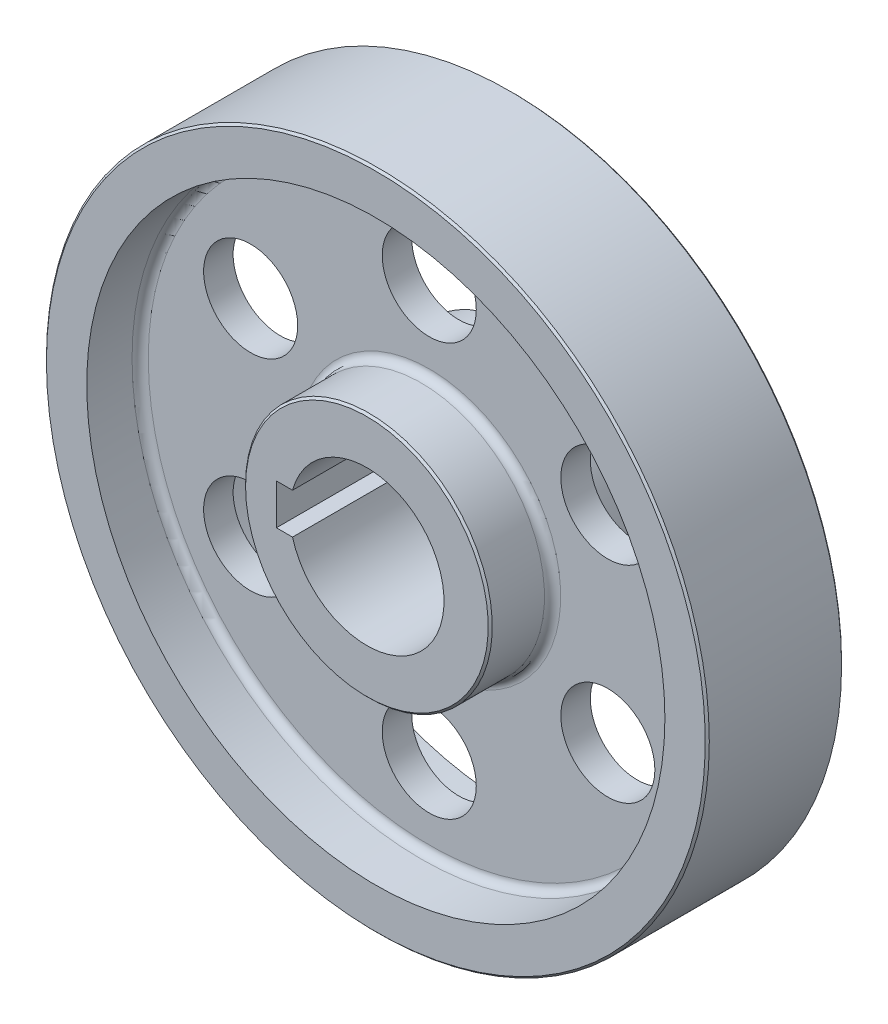
ISO-10303-21;
HEADER;
FILE_DESCRIPTION(('STEP AP214'),'2;1');
FILE_NAME('part.step','',(''),(''),'','','');
FILE_SCHEMA(('AUTOMOTIVE_DESIGN { 1 0 10303 214 1 1 1 1 }'));
ENDSEC;
DATA;
#1=APPLICATION_CONTEXT('core data for automotive mechanical design processes');
#2=APPLICATION_PROTOCOL_DEFINITION('international standard','automotive_design',2000,#1);
#3=PRODUCT_CONTEXT('',#1,'mechanical');
#4=PRODUCT('Part','Part','',(#3));
#5=PRODUCT_RELATED_PRODUCT_CATEGORY('part','',(#4));
#6=PRODUCT_DEFINITION_FORMATION('','',#4);
#7=PRODUCT_DEFINITION_CONTEXT('part definition',#1,'design');
#8=PRODUCT_DEFINITION('design','',#6,#7);
#9=PRODUCT_DEFINITION_SHAPE('','',#8);
#10=(LENGTH_UNIT() NAMED_UNIT(*) SI_UNIT(.MILLI.,.METRE.));
#11=(NAMED_UNIT(*) PLANE_ANGLE_UNIT() SI_UNIT($,.RADIAN.));
#12=(NAMED_UNIT(*) SI_UNIT($,.STERADIAN.) SOLID_ANGLE_UNIT());
#13=UNCERTAINTY_MEASURE_WITH_UNIT(LENGTH_MEASURE(1.E-05),#10,'distance_accuracy_value','');
#14=(GEOMETRIC_REPRESENTATION_CONTEXT(3) GLOBAL_UNCERTAINTY_ASSIGNED_CONTEXT((#13)) GLOBAL_UNIT_ASSIGNED_CONTEXT((#10,
#11,#12)) REPRESENTATION_CONTEXT('',''));
#15=CARTESIAN_POINT('',(0.,0.,0.));
#16=DIRECTION('',(0.,0.,1.));
#17=DIRECTION('',(1.,0.,0.));
#18=AXIS2_PLACEMENT_3D('',#15,#16,#17);
#19=CARTESIAN_POINT('',(0.,71.23775235,-5.2212868015927));
#20=DIRECTION('',(0.,0.,1.));
#21=DIRECTION('',(1.,0.,0.));
#22=AXIS2_PLACEMENT_3D('',#19,#20,#21);
#23=PLANE('',#22);
#24=CARTESIAN_POINT('',(0.,0.,-5.2212868015927));
#25=DIRECTION('',(0.,0.,1.));
#26=DIRECTION('',(1.,0.,0.));
#27=AXIS2_PLACEMENT_3D('',#24,#25,#26);
#28=CIRCLE('',#27,69.23775235);
#29=CARTESIAN_POINT('',(69.23775235,0.,-5.2212868015927));
#30=VERTEX_POINT('',#29);
#31=EDGE_CURVE('E420',#30,#30,#28,.F.);
#32=ORIENTED_EDGE('',*,*,#31,.T.);
#33=EDGE_LOOP('',(#32));
#34=FACE_BOUND('',#33,.T.);
#35=CARTESIAN_POINT('',(0.,0.,-5.2212868015927));
#36=DIRECTION('',(0.,0.,1.));
#37=DIRECTION('',(1.,0.,0.));
#38=AXIS2_PLACEMENT_3D('',#35,#36,#37);
#39=CIRCLE('',#38,32.4);
#40=CARTESIAN_POINT('',(32.4,0.,-5.2212868015927));
#41=VERTEX_POINT('',#40);
#42=EDGE_CURVE('E416',#41,#41,#39,.T.);
#43=ORIENTED_EDGE('',*,*,#42,.T.);
#44=EDGE_LOOP('',(#43));
#45=FACE_BOUND('',#44,.T.);
#46=CARTESIAN_POINT('',(0.,50.8188762,-5.2212868015927));
#47=DIRECTION('',(0.,0.,1.));
#48=DIRECTION('',(1.,0.,0.));
#49=AXIS2_PLACEMENT_3D('',#46,#47,#48);
#50=CIRCLE('',#49,11.58920475);
#51=CARTESIAN_POINT('',(11.58920475,50.8188762,-5.2212868015927));
#52=VERTEX_POINT('',#51);
#53=EDGE_CURVE('E339',#52,#52,#50,.F.);
#54=ORIENTED_EDGE('',*,*,#53,.F.);
#55=EDGE_LOOP('',(#54));
#56=FACE_BOUND('',#55,.T.);
#57=CARTESIAN_POINT('',(-44.0104377809757,25.4094380999987,-5.2212868015927));
#58=DIRECTION('',(0.,0.,1.));
#59=DIRECTION('',(1.,0.,0.));
#60=AXIS2_PLACEMENT_3D('',#57,#58,#59);
#61=CIRCLE('',#60,11.5892047500017);
#62=CARTESIAN_POINT('',(-32.4212330309741,25.4094380999987,-5.2212868015927));
#63=VERTEX_POINT('',#62);
#64=EDGE_CURVE('E348',#63,#63,#61,.F.);
#65=ORIENTED_EDGE('',*,*,#64,.F.);
#66=EDGE_LOOP('',(#65));
#67=FACE_BOUND('',#66,.T.);
#68=CARTESIAN_POINT('',(2.87004811364977E-12,-50.8188762,-5.2212868015927));
#69=DIRECTION('',(0.,0.,1.));
#70=DIRECTION('',(1.,0.,0.));
#71=AXIS2_PLACEMENT_3D('',#68,#69,#70);
#72=CIRCLE('',#71,11.5892047500031);
#73=CARTESIAN_POINT('',(11.589204750006,-50.8188762,-5.2212868015927));
#74=VERTEX_POINT('',#73);
#75=EDGE_CURVE('E365',#74,#74,#72,.F.);
#76=ORIENTED_EDGE('',*,*,#75,.F.);
#77=EDGE_LOOP('',(#76));
#78=FACE_BOUND('',#77,.T.);
#79=CARTESIAN_POINT('',(44.0104377809786,-25.4094380999988,-5.2212868015927));
#80=DIRECTION('',(0.,0.,1.));
#81=DIRECTION('',(1.,0.,0.));
#82=AXIS2_PLACEMENT_3D('',#79,#80,#81);
#83=CIRCLE('',#82,11.5892047500019);
#84=CARTESIAN_POINT('',(55.5996425309805,-25.4094380999988,-5.2212868015927));
#85=VERTEX_POINT('',#84);
#86=EDGE_CURVE('E357',#85,#85,#83,.F.);
#87=ORIENTED_EDGE('',*,*,#86,.F.);
#88=EDGE_LOOP('',(#87));
#89=FACE_BOUND('',#88,.T.);
#90=CARTESIAN_POINT('',(44.0104377809771,25.4094381000013,-5.2212868015927));
#91=DIRECTION('',(0.,0.,1.));
#92=DIRECTION('',(1.,0.,0.));
#93=AXIS2_PLACEMENT_3D('',#90,#91,#92);
#94=CIRCLE('',#93,11.5892047500004);
#95=CARTESIAN_POINT('',(55.5996425309776,25.4094381000013,-5.2212868015927));
#96=VERTEX_POINT('',#95);
#97=EDGE_CURVE('E340',#96,#96,#94,.F.);
#98=ORIENTED_EDGE('',*,*,#97,.F.);
#99=EDGE_LOOP('',(#98));
#100=FACE_BOUND('',#99,.T.);
#101=CARTESIAN_POINT('',(-44.0104377809742,-25.4094381000013,-5.2212868015927));
#102=DIRECTION('',(0.,0.,1.));
#103=DIRECTION('',(1.,0.,0.));
#104=AXIS2_PLACEMENT_3D('',#101,#102,#103);
#105=CIRCLE('',#104,11.5892047500029);
#106=CARTESIAN_POINT('',(-32.4212330309714,-25.4094381000013,-5.2212868015927));
#107=VERTEX_POINT('',#106);
#108=EDGE_CURVE('E373',#107,#107,#105,.F.);
#109=ORIENTED_EDGE('',*,*,#108,.F.);
#110=EDGE_LOOP('',(#109));
#111=FACE_BOUND('',#110,.T.);
#112=ADVANCED_FACE('F249',(#34,#45,#56,#67,#78,#89,#100,#111),#23,.F.);
#113=CARTESIAN_POINT('',(0.,71.23775235,2.0494716984073));
#114=DIRECTION('',(0.,0.,-1.));
#115=DIRECTION('',(-1.,0.,0.));
#116=AXIS2_PLACEMENT_3D('',#113,#114,#115);
#117=PLANE('',#116);
#118=CARTESIAN_POINT('',(0.,0.,2.0494716984073));
#119=DIRECTION('',(0.,0.,-1.));
#120=DIRECTION('',(-1.,0.,0.));
#121=AXIS2_PLACEMENT_3D('',#118,#119,#120);
#122=CIRCLE('',#121,32.4);
#123=CARTESIAN_POINT('',(-32.4,0.,2.0494716984073));
#124=VERTEX_POINT('',#123);
#125=EDGE_CURVE('E404',#124,#124,#122,.T.);
#126=ORIENTED_EDGE('',*,*,#125,.T.);
#127=EDGE_LOOP('',(#126));
#128=FACE_BOUND('',#127,.T.);
#129=CARTESIAN_POINT('',(0.,0.,2.0494716984073));
#130=DIRECTION('',(0.,0.,-1.));
#131=DIRECTION('',(-1.,0.,0.));
#132=AXIS2_PLACEMENT_3D('',#129,#130,#131);
#133=CIRCLE('',#132,69.23775235);
#134=CARTESIAN_POINT('',(-69.23775235,0.,2.0494716984073));
#135=VERTEX_POINT('',#134);
#136=EDGE_CURVE('E400',#135,#135,#133,.F.);
#137=ORIENTED_EDGE('',*,*,#136,.T.);
#138=EDGE_LOOP('',(#137));
#139=FACE_BOUND('',#138,.T.);
#140=CARTESIAN_POINT('',(0.,50.8188762,2.0494716984073));
#141=DIRECTION('',(0.,0.,1.));
#142=DIRECTION('',(1.,0.,0.));
#143=AXIS2_PLACEMENT_3D('',#140,#141,#142);
#144=CIRCLE('',#143,11.58920475);
#145=CARTESIAN_POINT('',(11.58920475,50.8188762,2.0494716984073));
#146=VERTEX_POINT('',#145);
#147=EDGE_CURVE('E335',#146,#146,#144,.T.);
#148=ORIENTED_EDGE('',*,*,#147,.F.);
#149=EDGE_LOOP('',(#148));
#150=FACE_BOUND('',#149,.T.);
#151=CARTESIAN_POINT('',(-44.0104377809757,25.4094380999987,2.0494716984073));
#152=DIRECTION('',(0.,0.,1.));
#153=DIRECTION('',(1.,0.,0.));
#154=AXIS2_PLACEMENT_3D('',#151,#152,#153);
#155=CIRCLE('',#154,11.5892047500017);
#156=CARTESIAN_POINT('',(-32.4212330309741,25.4094380999987,2.0494716984073));
#157=VERTEX_POINT('',#156);
#158=EDGE_CURVE('E307',#157,#157,#155,.T.);
#159=ORIENTED_EDGE('',*,*,#158,.F.);
#160=EDGE_LOOP('',(#159));
#161=FACE_BOUND('',#160,.T.);
#162=CARTESIAN_POINT('',(2.87004811364977E-12,-50.8188762,2.0494716984073));
#163=DIRECTION('',(0.,0.,1.));
#164=DIRECTION('',(1.,0.,0.));
#165=AXIS2_PLACEMENT_3D('',#162,#163,#164);
#166=CIRCLE('',#165,11.5892047500031);
#167=CARTESIAN_POINT('',(11.589204750006,-50.8188762,2.0494716984073));
#168=VERTEX_POINT('',#167);
#169=EDGE_CURVE('E369',#168,#168,#166,.T.);
#170=ORIENTED_EDGE('',*,*,#169,.F.);
#171=EDGE_LOOP('',(#170));
#172=FACE_BOUND('',#171,.T.);
#173=CARTESIAN_POINT('',(44.0104377809786,-25.4094380999988,2.0494716984073));
#174=DIRECTION('',(0.,0.,1.));
#175=DIRECTION('',(1.,0.,0.));
#176=AXIS2_PLACEMENT_3D('',#173,#174,#175);
#177=CIRCLE('',#176,11.5892047500019);
#178=CARTESIAN_POINT('',(55.5996425309805,-25.4094380999988,2.0494716984073));
#179=VERTEX_POINT('',#178);
#180=EDGE_CURVE('E361',#179,#179,#177,.T.);
#181=ORIENTED_EDGE('',*,*,#180,.F.);
#182=EDGE_LOOP('',(#181));
#183=FACE_BOUND('',#182,.T.);
#184=CARTESIAN_POINT('',(44.0104377809771,25.4094381000013,2.0494716984073));
#185=DIRECTION('',(0.,0.,1.));
#186=DIRECTION('',(1.,0.,0.));
#187=AXIS2_PLACEMENT_3D('',#184,#185,#186);
#188=CIRCLE('',#187,11.5892047500004);
#189=CARTESIAN_POINT('',(55.5996425309776,25.4094381000013,2.0494716984073));
#190=VERTEX_POINT('',#189);
#191=EDGE_CURVE('E353',#190,#190,#188,.T.);
#192=ORIENTED_EDGE('',*,*,#191,.F.);
#193=EDGE_LOOP('',(#192));
#194=FACE_BOUND('',#193,.T.);
#195=CARTESIAN_POINT('',(-44.0104377809742,-25.4094381000013,2.0494716984073));
#196=DIRECTION('',(0.,0.,1.));
#197=DIRECTION('',(1.,0.,0.));
#198=AXIS2_PLACEMENT_3D('',#195,#196,#197);
#199=CIRCLE('',#198,11.5892047500029);
#200=CARTESIAN_POINT('',(-32.4212330309714,-25.4094381000013,2.0494716984073));
#201=VERTEX_POINT('',#200);
#202=EDGE_CURVE('E352',#201,#201,#199,.T.);
#203=ORIENTED_EDGE('',*,*,#202,.F.);
#204=EDGE_LOOP('',(#203));
#205=FACE_BOUND('',#204,.T.);
#206=ADVANCED_FACE('F484',(#128,#139,#150,#161,#172,#183,#194,#205),#117,.F.);
#207=CARTESIAN_POINT('',(0.,30.4,17.4140924484073));
#208=DIRECTION('',(0.,0.,-1.));
#209=DIRECTION('',(-1.,0.,0.));
#210=AXIS2_PLACEMENT_3D('',#207,#208,#209);
#211=PLANE('',#210);
#212=CARTESIAN_POINT('',(0.,0.,17.4140924484073));
#213=DIRECTION('',(0.,0.,-1.));
#214=DIRECTION('',(-1.,0.,0.));
#215=AXIS2_PLACEMENT_3D('',#212,#213,#214);
#216=CIRCLE('',#215,29.9);
#217=CARTESIAN_POINT('',(-29.9,0.,17.4140924484073));
#218=VERTEX_POINT('',#217);
#219=EDGE_CURVE('E436',#218,#218,#216,.F.);
#220=ORIENTED_EDGE('',*,*,#219,.T.);
#221=EDGE_LOOP('',(#220));
#222=FACE_BOUND('',#221,.T.);
#223=DIRECTION('',(0.,-1.,0.));
#224=VECTOR('',#223,1.);
#225=CARTESIAN_POINT('',(-22.3,5.,17.4140924484073));
#226=LINE('',#225,#224);
#227=CARTESIAN_POINT('',(-22.3,5.,17.4140924484073));
#228=VERTEX_POINT('',#227);
#229=CARTESIAN_POINT('',(-22.3,-5.,17.4140924484073));
#230=VERTEX_POINT('',#229);
#231=EDGE_CURVE('E319',#228,#230,#226,.T.);
#232=ORIENTED_EDGE('',*,*,#231,.F.);
#233=DIRECTION('',(-1.,0.,0.));
#234=VECTOR('',#233,1.);
#235=CARTESIAN_POINT('',(-22.3,5.,17.4140924484073));
#236=LINE('',#235,#234);
#237=CARTESIAN_POINT('',(-18.3303027798234,5.,17.4140924484073));
#238=VERTEX_POINT('',#237);
#239=EDGE_CURVE('E294',#238,#228,#236,.T.);
#240=ORIENTED_EDGE('',*,*,#239,.F.);
#241=CARTESIAN_POINT('',(0.,0.,17.4140924484073));
#242=DIRECTION('',(0.,0.,1.));
#243=DIRECTION('',(1.,0.,0.));
#244=AXIS2_PLACEMENT_3D('',#241,#242,#243);
#245=CIRCLE('',#244,19.);
#246=CARTESIAN_POINT('',(-18.3303027798234,-5.,17.4140924484073));
#247=VERTEX_POINT('',#246);
#248=EDGE_CURVE('E392',#247,#238,#245,.T.);
#249=ORIENTED_EDGE('',*,*,#248,.F.);
#250=DIRECTION('',(1.,0.,0.));
#251=VECTOR('',#250,1.);
#252=CARTESIAN_POINT('',(-22.3,-5.,17.4140924484073));
#253=LINE('',#252,#251);
#254=EDGE_CURVE('E300',#230,#247,#253,.T.);
#255=ORIENTED_EDGE('',*,*,#254,.F.);
#256=EDGE_LOOP('',(#232,#240,#249,#255));
#257=FACE_BOUND('',#256,.T.);
#258=ADVANCED_FACE('F490',(#222,#257),#211,.F.);
#259=CARTESIAN_POINT('',(0.,0.,17.4140924484073));
#260=DIRECTION('',(0.,0.,1.));
#261=DIRECTION('',(1.,0.,0.));
#262=AXIS2_PLACEMENT_3D('',#259,#260,#261);
#263=CYLINDRICAL_SURFACE('',#262,19.);
#264=ORIENTED_EDGE('',*,*,#248,.T.);
#265=DIRECTION('',(0.,0.,1.));
#266=VECTOR('',#265,1.);
#267=CARTESIAN_POINT('',(-18.3303027798234,5.,-20.5869075515927));
#268=LINE('',#267,#266);
#269=CARTESIAN_POINT('',(-18.3303027798234,5.,-20.5859075515927));
#270=VERTEX_POINT('',#269);
#271=EDGE_CURVE('E308',#270,#238,#268,.T.);
#272=ORIENTED_EDGE('',*,*,#271,.F.);
#273=CARTESIAN_POINT('',(0.,0.,-20.5859075515927));
#274=DIRECTION('',(0.,0.,1.));
#275=DIRECTION('',(1.,0.,0.));
#276=AXIS2_PLACEMENT_3D('',#273,#274,#275);
#277=CIRCLE('',#276,19.);
#278=CARTESIAN_POINT('',(-18.3303027798234,-5.,-20.5859075515927));
#279=VERTEX_POINT('',#278);
#280=EDGE_CURVE('E313',#279,#270,#277,.T.);
#281=ORIENTED_EDGE('',*,*,#280,.F.);
#282=DIRECTION('',(0.,0.,1.));
#283=VECTOR('',#282,1.);
#284=CARTESIAN_POINT('',(-18.3303027798234,-5.,-20.5869075515927));
#285=LINE('',#284,#283);
#286=EDGE_CURVE('E329',#279,#247,#285,.T.);
#287=ORIENTED_EDGE('',*,*,#286,.T.);
#288=EDGE_LOOP('',(#264,#272,#281,#287));
#289=FACE_BOUND('',#288,.T.);
#290=ADVANCED_FACE('F503',(#289),#263,.F.);
#291=CARTESIAN_POINT('',(0.,19.,-20.5859075515927));
#292=DIRECTION('',(0.,0.,1.));
#293=DIRECTION('',(1.,0.,0.));
#294=AXIS2_PLACEMENT_3D('',#291,#292,#293);
#295=PLANE('',#294);
#296=CARTESIAN_POINT('',(0.,0.,-20.5859075515927));
#297=DIRECTION('',(0.,0.,1.));
#298=DIRECTION('',(1.,0.,0.));
#299=AXIS2_PLACEMENT_3D('',#296,#297,#298);
#300=CIRCLE('',#299,29.9);
#301=CARTESIAN_POINT('',(29.9,0.,-20.5859075515927));
#302=VERTEX_POINT('',#301);
#303=EDGE_CURVE('E432',#302,#302,#300,.F.);
#304=ORIENTED_EDGE('',*,*,#303,.T.);
#305=EDGE_LOOP('',(#304));
#306=FACE_BOUND('',#305,.T.);
#307=ORIENTED_EDGE('',*,*,#280,.T.);
#308=DIRECTION('',(1.,0.,0.));
#309=VECTOR('',#308,1.);
#310=CARTESIAN_POINT('',(-22.3,5.,-20.5859075515927));
#311=LINE('',#310,#309);
#312=CARTESIAN_POINT('',(-22.3,5.,-20.5859075515927));
#313=VERTEX_POINT('',#312);
#314=EDGE_CURVE('E274',#313,#270,#311,.T.);
#315=ORIENTED_EDGE('',*,*,#314,.F.);
#316=DIRECTION('',(0.,1.,0.));
#317=VECTOR('',#316,1.);
#318=CARTESIAN_POINT('',(-22.3,5.,-20.5859075515927));
#319=LINE('',#318,#317);
#320=CARTESIAN_POINT('',(-22.3,-5.,-20.5859075515927));
#321=VERTEX_POINT('',#320);
#322=EDGE_CURVE('E303',#321,#313,#319,.T.);
#323=ORIENTED_EDGE('',*,*,#322,.F.);
#324=DIRECTION('',(-1.,0.,0.));
#325=VECTOR('',#324,1.);
#326=CARTESIAN_POINT('',(-22.3,-5.,-20.5859075515927));
#327=LINE('',#326,#325);
#328=EDGE_CURVE('E266',#279,#321,#327,.T.);
#329=ORIENTED_EDGE('',*,*,#328,.F.);
#330=EDGE_LOOP('',(#307,#315,#323,#329));
#331=FACE_BOUND('',#330,.T.);
#332=ADVANCED_FACE('F311',(#306,#331),#295,.F.);
#333=CARTESIAN_POINT('',(0.,0.,17.4140924484073));
#334=DIRECTION('',(0.,0.,1.));
#335=DIRECTION('',(1.,0.,0.));
#336=AXIS2_PLACEMENT_3D('',#333,#334,#335);
#337=CYLINDRICAL_SURFACE('',#336,30.4);
#338=CARTESIAN_POINT('',(0.,0.,-20.0859075515927));
#339=DIRECTION('',(0.,0.,1.));
#340=DIRECTION('',(1.,0.,0.));
#341=AXIS2_PLACEMENT_3D('',#338,#339,#340);
#342=CIRCLE('',#341,30.4);
#343=CARTESIAN_POINT('',(30.4,0.,-20.0859075515927));
#344=VERTEX_POINT('',#343);
#345=EDGE_CURVE('E428',#344,#344,#342,.T.);
#346=ORIENTED_EDGE('',*,*,#345,.T.);
#347=EDGE_LOOP('',(#346));
#348=FACE_BOUND('',#347,.T.);
#349=CARTESIAN_POINT('',(0.,0.,-7.2212868015927));
#350=DIRECTION('',(0.,0.,1.));
#351=DIRECTION('',(1.,0.,0.));
#352=AXIS2_PLACEMENT_3D('',#349,#350,#351);
#353=CIRCLE('',#352,30.4);
#354=CARTESIAN_POINT('',(30.4,0.,-7.2212868015927));
#355=VERTEX_POINT('',#354);
#356=EDGE_CURVE('E424',#355,#355,#353,.F.);
#357=ORIENTED_EDGE('',*,*,#356,.T.);
#358=EDGE_LOOP('',(#357));
#359=FACE_BOUND('',#358,.T.);
#360=ADVANCED_FACE('F497',(#348,#359),#337,.T.);
#361=CARTESIAN_POINT('',(0.,0.,17.4140924484073));
#362=DIRECTION('',(0.,0.,1.));
#363=DIRECTION('',(1.,0.,0.));
#364=AXIS2_PLACEMENT_3D('',#361,#362,#363);
#365=CYLINDRICAL_SURFACE('',#364,71.23775235);
#366=CARTESIAN_POINT('',(0.,0.,-7.2212868015927));
#367=DIRECTION('',(0.,0.,1.));
#368=DIRECTION('',(1.,0.,0.));
#369=AXIS2_PLACEMENT_3D('',#366,#367,#368);
#370=CIRCLE('',#369,71.23775235);
#371=CARTESIAN_POINT('',(71.23775235,0.,-7.2212868015927));
#372=VERTEX_POINT('',#371);
#373=EDGE_CURVE('E412',#372,#372,#370,.T.);
#374=ORIENTED_EDGE('',*,*,#373,.T.);
#375=EDGE_LOOP('',(#374));
#376=FACE_BOUND('',#375,.T.);
#377=CARTESIAN_POINT('',(0.,0.,-18.3859075515927));
#378=DIRECTION('',(0.,0.,1.));
#379=DIRECTION('',(1.,0.,0.));
#380=AXIS2_PLACEMENT_3D('',#377,#378,#379);
#381=CIRCLE('',#380,71.23775235);
#382=CARTESIAN_POINT('',(71.23775235,0.,-18.3859075515927));
#383=VERTEX_POINT('',#382);
#384=EDGE_CURVE('E386',#383,#383,#381,.T.);
#385=ORIENTED_EDGE('',*,*,#384,.F.);
#386=EDGE_LOOP('',(#385));
#387=FACE_BOUND('',#386,.T.);
#388=ADVANCED_FACE('F495',(#376,#387),#365,.F.);
#389=CARTESIAN_POINT('',(0.,71.23775235,-18.3859075515927));
#390=DIRECTION('',(0.,0.,1.));
#391=DIRECTION('',(1.,0.,0.));
#392=AXIS2_PLACEMENT_3D('',#389,#390,#391);
#393=PLANE('',#392);
#394=CARTESIAN_POINT('',(0.,0.,-18.3859075515927));
#395=DIRECTION('',(0.,0.,1.));
#396=DIRECTION('',(1.,0.,0.));
#397=AXIS2_PLACEMENT_3D('',#394,#395,#396);
#398=CIRCLE('',#397,81.1785385);
#399=CARTESIAN_POINT('',(81.1785385,0.,-18.3859075515927));
#400=VERTEX_POINT('',#399);
#401=EDGE_CURVE('E12',#400,#400,#398,.F.);
#402=ORIENTED_EDGE('',*,*,#401,.T.);
#403=EDGE_LOOP('',(#402));
#404=FACE_BOUND('',#403,.T.);
#405=ORIENTED_EDGE('',*,*,#384,.T.);
#406=EDGE_LOOP('',(#405));
#407=FACE_BOUND('',#406,.T.);
#408=ADVANCED_FACE('F652',(#404,#407),#393,.F.);
#409=CARTESIAN_POINT('',(0.,0.,17.4140924484073));
#410=DIRECTION('',(0.,0.,1.));
#411=DIRECTION('',(1.,0.,0.));
#412=AXIS2_PLACEMENT_3D('',#409,#410,#411);
#413=CYLINDRICAL_SURFACE('',#412,81.6785385);
#414=CARTESIAN_POINT('',(0.,0.,14.7140924484073));
#415=DIRECTION('',(0.,0.,-1.));
#416=DIRECTION('',(-1.,0.,0.));
#417=AXIS2_PLACEMENT_3D('',#414,#415,#416);
#418=CIRCLE('',#417,81.6785385);
#419=CARTESIAN_POINT('',(-81.6785385,0.,14.7140924484073));
#420=VERTEX_POINT('',#419);
#421=EDGE_CURVE('E259',#420,#420,#418,.T.);
#422=ORIENTED_EDGE('',*,*,#421,.T.);
#423=EDGE_LOOP('',(#422));
#424=FACE_BOUND('',#423,.T.);
#425=CARTESIAN_POINT('',(0.,0.,-17.8859075515927));
#426=DIRECTION('',(0.,0.,1.));
#427=DIRECTION('',(1.,0.,0.));
#428=AXIS2_PLACEMENT_3D('',#425,#426,#427);
#429=CIRCLE('',#428,81.6785385);
#430=CARTESIAN_POINT('',(81.6785385,0.,-17.8859075515927));
#431=VERTEX_POINT('',#430);
#432=EDGE_CURVE('E448',#431,#431,#429,.T.);
#433=ORIENTED_EDGE('',*,*,#432,.T.);
#434=EDGE_LOOP('',(#433));
#435=FACE_BOUND('',#434,.T.);
#436=ADVANCED_FACE('F456',(#424,#435),#413,.T.);
#437=CARTESIAN_POINT('',(0.,81.6785385,15.2140924484073));
#438=DIRECTION('',(0.,0.,-1.));
#439=DIRECTION('',(-1.,0.,0.));
#440=AXIS2_PLACEMENT_3D('',#437,#438,#439);
#441=PLANE('',#440);
#442=CARTESIAN_POINT('',(0.,0.,15.2140924484073));
#443=DIRECTION('',(0.,0.,-1.));
#444=DIRECTION('',(-1.,0.,0.));
#445=AXIS2_PLACEMENT_3D('',#442,#443,#444);
#446=CIRCLE('',#445,81.1785385);
#447=CARTESIAN_POINT('',(-81.1785385,0.,15.2140924484073));
#448=VERTEX_POINT('',#447);
#449=EDGE_CURVE('E444',#448,#448,#446,.F.);
#450=ORIENTED_EDGE('',*,*,#449,.T.);
#451=EDGE_LOOP('',(#450));
#452=FACE_BOUND('',#451,.T.);
#453=CARTESIAN_POINT('',(0.,0.,15.2140924484073));
#454=DIRECTION('',(0.,0.,1.));
#455=DIRECTION('',(1.,0.,0.));
#456=AXIS2_PLACEMENT_3D('',#453,#454,#455);
#457=CIRCLE('',#456,71.23775235);
#458=CARTESIAN_POINT('',(71.23775235,0.,15.2140924484073));
#459=VERTEX_POINT('',#458);
#460=EDGE_CURVE('E344',#459,#459,#457,.T.);
#461=ORIENTED_EDGE('',*,*,#460,.F.);
#462=EDGE_LOOP('',(#461));
#463=FACE_BOUND('',#462,.T.);
#464=ADVANCED_FACE('F465',(#452,#463),#441,.F.);
#465=CARTESIAN_POINT('',(0.,0.,17.4140924484073));
#466=DIRECTION('',(0.,0.,1.));
#467=DIRECTION('',(1.,0.,0.));
#468=AXIS2_PLACEMENT_3D('',#465,#466,#467);
#469=CYLINDRICAL_SURFACE('',#468,71.23775235);
#470=CARTESIAN_POINT('',(0.,0.,4.0494716984073));
#471=DIRECTION('',(0.,0.,-1.));
#472=DIRECTION('',(-1.,0.,0.));
#473=AXIS2_PLACEMENT_3D('',#470,#471,#472);
#474=CIRCLE('',#473,71.23775235);
#475=CARTESIAN_POINT('',(-71.23775235,0.,4.0494716984073));
#476=VERTEX_POINT('',#475);
#477=EDGE_CURVE('E408',#476,#476,#474,.T.);
#478=ORIENTED_EDGE('',*,*,#477,.T.);
#479=EDGE_LOOP('',(#478));
#480=FACE_BOUND('',#479,.T.);
#481=ORIENTED_EDGE('',*,*,#460,.T.);
#482=EDGE_LOOP('',(#481));
#483=FACE_BOUND('',#482,.T.);
#484=ADVANCED_FACE('F468',(#480,#483),#469,.F.);
#485=CARTESIAN_POINT('',(0.,0.,17.4140924484073));
#486=DIRECTION('',(0.,0.,1.));
#487=DIRECTION('',(1.,0.,0.));
#488=AXIS2_PLACEMENT_3D('',#485,#486,#487);
#489=CYLINDRICAL_SURFACE('',#488,30.4);
#490=CARTESIAN_POINT('',(0.,0.,16.9140924484073));
#491=DIRECTION('',(0.,0.,-1.));
#492=DIRECTION('',(-1.,0.,0.));
#493=AXIS2_PLACEMENT_3D('',#490,#491,#492);
#494=CIRCLE('',#493,30.4);
#495=CARTESIAN_POINT('',(-30.4,0.,16.9140924484073));
#496=VERTEX_POINT('',#495);
#497=EDGE_CURVE('E440',#496,#496,#494,.T.);
#498=ORIENTED_EDGE('',*,*,#497,.T.);
#499=EDGE_LOOP('',(#498));
#500=FACE_BOUND('',#499,.T.);
#501=CARTESIAN_POINT('',(0.,0.,4.0494716984073));
#502=DIRECTION('',(0.,0.,-1.));
#503=DIRECTION('',(-1.,0.,0.));
#504=AXIS2_PLACEMENT_3D('',#501,#502,#503);
#505=CIRCLE('',#504,30.4);
#506=CARTESIAN_POINT('',(-30.4,0.,4.0494716984073));
#507=VERTEX_POINT('',#506);
#508=EDGE_CURVE('E396',#507,#507,#505,.F.);
#509=ORIENTED_EDGE('',*,*,#508,.T.);
#510=EDGE_LOOP('',(#509));
#511=FACE_BOUND('',#510,.T.);
#512=ADVANCED_FACE('F473',(#500,#511),#489,.T.);
#513=CARTESIAN_POINT('',(44.0104377809771,25.4094381000013,-20.5869075515927));
#514=DIRECTION('',(0.,0.,1.));
#515=DIRECTION('',(1.,0.,0.));
#516=AXIS2_PLACEMENT_3D('',#513,#514,#515);
#517=CYLINDRICAL_SURFACE('',#516,11.5892047500004);
#518=ORIENTED_EDGE('',*,*,#191,.T.);
#519=EDGE_LOOP('',(#518));
#520=FACE_BOUND('',#519,.T.);
#521=ORIENTED_EDGE('',*,*,#97,.T.);
#522=EDGE_LOOP('',(#521));
#523=FACE_BOUND('',#522,.T.);
#524=ADVANCED_FACE('F479',(#520,#523),#517,.F.);
#525=CARTESIAN_POINT('',(44.0104377809786,-25.4094380999988,-20.5869075515927));
#526=DIRECTION('',(0.,0.,1.));
#527=DIRECTION('',(1.,0.,0.));
#528=AXIS2_PLACEMENT_3D('',#525,#526,#527);
#529=CYLINDRICAL_SURFACE('',#528,11.5892047500019);
#530=ORIENTED_EDGE('',*,*,#180,.T.);
#531=EDGE_LOOP('',(#530));
#532=FACE_BOUND('',#531,.T.);
#533=ORIENTED_EDGE('',*,*,#86,.T.);
#534=EDGE_LOOP('',(#533));
#535=FACE_BOUND('',#534,.T.);
#536=ADVANCED_FACE('F574',(#532,#535),#529,.F.);
#537=CARTESIAN_POINT('',(2.87004811364977E-12,-50.8188762,-20.5869075515927));
#538=DIRECTION('',(0.,0.,1.));
#539=DIRECTION('',(1.,0.,0.));
#540=AXIS2_PLACEMENT_3D('',#537,#538,#539);
#541=CYLINDRICAL_SURFACE('',#540,11.5892047500031);
#542=ORIENTED_EDGE('',*,*,#169,.T.);
#543=EDGE_LOOP('',(#542));
#544=FACE_BOUND('',#543,.T.);
#545=ORIENTED_EDGE('',*,*,#75,.T.);
#546=EDGE_LOOP('',(#545));
#547=FACE_BOUND('',#546,.T.);
#548=ADVANCED_FACE('F570',(#544,#547),#541,.F.);
#549=CARTESIAN_POINT('',(-44.0104377809757,25.4094380999987,-20.5869075515927));
#550=DIRECTION('',(0.,0.,1.));
#551=DIRECTION('',(1.,0.,0.));
#552=AXIS2_PLACEMENT_3D('',#549,#550,#551);
#553=CYLINDRICAL_SURFACE('',#552,11.5892047500017);
#554=ORIENTED_EDGE('',*,*,#158,.T.);
#555=EDGE_LOOP('',(#554));
#556=FACE_BOUND('',#555,.T.);
#557=ORIENTED_EDGE('',*,*,#64,.T.);
#558=EDGE_LOOP('',(#557));
#559=FACE_BOUND('',#558,.T.);
#560=ADVANCED_FACE('F566',(#556,#559),#553,.F.);
#561=CARTESIAN_POINT('',(0.,50.8188762,-20.5869075515927));
#562=DIRECTION('',(0.,0.,1.));
#563=DIRECTION('',(1.,0.,0.));
#564=AXIS2_PLACEMENT_3D('',#561,#562,#563);
#565=CYLINDRICAL_SURFACE('',#564,11.58920475);
#566=ORIENTED_EDGE('',*,*,#147,.T.);
#567=EDGE_LOOP('',(#566));
#568=FACE_BOUND('',#567,.T.);
#569=ORIENTED_EDGE('',*,*,#53,.T.);
#570=EDGE_LOOP('',(#569));
#571=FACE_BOUND('',#570,.T.);
#572=ADVANCED_FACE('F563',(#568,#571),#565,.F.);
#573=CARTESIAN_POINT('',(-44.0104377809742,-25.4094381000013,-20.5869075515927));
#574=DIRECTION('',(0.,0.,1.));
#575=DIRECTION('',(1.,0.,0.));
#576=AXIS2_PLACEMENT_3D('',#573,#574,#575);
#577=CYLINDRICAL_SURFACE('',#576,11.5892047500029);
#578=ORIENTED_EDGE('',*,*,#202,.T.);
#579=EDGE_LOOP('',(#578));
#580=FACE_BOUND('',#579,.T.);
#581=ORIENTED_EDGE('',*,*,#108,.T.);
#582=EDGE_LOOP('',(#581));
#583=FACE_BOUND('',#582,.T.);
#584=ADVANCED_FACE('F515',(#580,#583),#577,.F.);
#585=CARTESIAN_POINT('',(0.,0.,4.0494716984073));
#586=DIRECTION('',(0.,0.,-1.));
#587=DIRECTION('',(-1.,0.,0.));
#588=AXIS2_PLACEMENT_3D('',#585,#586,#587);
#589=TOROIDAL_SURFACE('',#588,32.4,2.);
#590=ORIENTED_EDGE('',*,*,#125,.F.);
#591=EDGE_LOOP('',(#590));
#592=FACE_BOUND('',#591,.T.);
#593=ORIENTED_EDGE('',*,*,#508,.F.);
#594=EDGE_LOOP('',(#593));
#595=FACE_BOUND('',#594,.T.);
#596=ADVANCED_FACE('F511',(#592,#595),#589,.F.);
#597=CARTESIAN_POINT('',(0.,0.,4.0494716984073));
#598=DIRECTION('',(0.,0.,-1.));
#599=DIRECTION('',(-1.,0.,0.));
#600=AXIS2_PLACEMENT_3D('',#597,#598,#599);
#601=TOROIDAL_SURFACE('',#600,69.23775235,2.);
#602=ORIENTED_EDGE('',*,*,#477,.F.);
#603=EDGE_LOOP('',(#602));
#604=FACE_BOUND('',#603,.T.);
#605=ORIENTED_EDGE('',*,*,#136,.F.);
#606=EDGE_LOOP('',(#605));
#607=FACE_BOUND('',#606,.T.);
#608=ADVANCED_FACE('F514',(#604,#607),#601,.F.);
#609=CARTESIAN_POINT('',(0.,0.,-7.2212868015927));
#610=DIRECTION('',(0.,0.,1.));
#611=DIRECTION('',(1.,0.,0.));
#612=AXIS2_PLACEMENT_3D('',#609,#610,#611);
#613=TOROIDAL_SURFACE('',#612,69.23775235,2.);
#614=ORIENTED_EDGE('',*,*,#31,.F.);
#615=EDGE_LOOP('',(#614));
#616=FACE_BOUND('',#615,.T.);
#617=ORIENTED_EDGE('',*,*,#373,.F.);
#618=EDGE_LOOP('',(#617));
#619=FACE_BOUND('',#618,.T.);
#620=ADVANCED_FACE('F519',(#616,#619),#613,.F.);
#621=CARTESIAN_POINT('',(0.,0.,-7.2212868015927));
#622=DIRECTION('',(0.,0.,1.));
#623=DIRECTION('',(1.,0.,0.));
#624=AXIS2_PLACEMENT_3D('',#621,#622,#623);
#625=TOROIDAL_SURFACE('',#624,32.4,2.);
#626=ORIENTED_EDGE('',*,*,#356,.F.);
#627=EDGE_LOOP('',(#626));
#628=FACE_BOUND('',#627,.T.);
#629=ORIENTED_EDGE('',*,*,#42,.F.);
#630=EDGE_LOOP('',(#629));
#631=FACE_BOUND('',#630,.T.);
#632=ADVANCED_FACE('F523',(#628,#631),#625,.F.);
#633=CARTESIAN_POINT('',(-22.3,5.,-20.5869075515927));
#634=DIRECTION('',(0.,1.,0.));
#635=DIRECTION('',(0.,0.,1.));
#636=AXIS2_PLACEMENT_3D('',#633,#634,#635);
#637=PLANE('',#636);
#638=ORIENTED_EDGE('',*,*,#314,.T.);
#639=ORIENTED_EDGE('',*,*,#271,.T.);
#640=ORIENTED_EDGE('',*,*,#239,.T.);
#641=DIRECTION('',(0.,0.,1.));
#642=VECTOR('',#641,1.);
#643=CARTESIAN_POINT('',(-22.3,5.,-20.5869075515927));
#644=LINE('',#643,#642);
#645=EDGE_CURVE('E290',#313,#228,#644,.T.);
#646=ORIENTED_EDGE('',*,*,#645,.F.);
#647=EDGE_LOOP('',(#638,#639,#640,#646));
#648=FACE_BOUND('',#647,.T.);
#649=ADVANCED_FACE('F292',(#648),#637,.F.);
#650=CARTESIAN_POINT('',(-22.3,-5.,-20.5869075515927));
#651=DIRECTION('',(0.,-1.,0.));
#652=DIRECTION('',(0.,0.,-1.));
#653=AXIS2_PLACEMENT_3D('',#650,#651,#652);
#654=PLANE('',#653);
#655=ORIENTED_EDGE('',*,*,#328,.T.);
#656=DIRECTION('',(0.,0.,1.));
#657=VECTOR('',#656,1.);
#658=CARTESIAN_POINT('',(-22.3,-5.,-20.5869075515927));
#659=LINE('',#658,#657);
#660=EDGE_CURVE('E299',#321,#230,#659,.T.);
#661=ORIENTED_EDGE('',*,*,#660,.T.);
#662=ORIENTED_EDGE('',*,*,#254,.T.);
#663=ORIENTED_EDGE('',*,*,#286,.F.);
#664=EDGE_LOOP('',(#655,#661,#662,#663));
#665=FACE_BOUND('',#664,.T.);
#666=ADVANCED_FACE('F553',(#665),#654,.F.);
#667=CARTESIAN_POINT('',(-22.3,5.,-20.5869075515927));
#668=DIRECTION('',(-1.,0.,0.));
#669=DIRECTION('',(0.,0.,1.));
#670=AXIS2_PLACEMENT_3D('',#667,#668,#669);
#671=PLANE('',#670);
#672=ORIENTED_EDGE('',*,*,#322,.T.);
#673=ORIENTED_EDGE('',*,*,#645,.T.);
#674=ORIENTED_EDGE('',*,*,#231,.T.);
#675=ORIENTED_EDGE('',*,*,#660,.F.);
#676=EDGE_LOOP('',(#672,#673,#674,#675));
#677=FACE_BOUND('',#676,.T.);
#678=ADVANCED_FACE('F304',(#677),#671,.F.);
#679=CARTESIAN_POINT('',(0.,0.,-20.0859075515927));
#680=DIRECTION('',(0.,0.,1.));
#681=DIRECTION('',(1.,0.,0.));
#682=AXIS2_PLACEMENT_3D('',#679,#680,#681);
#683=CONICAL_SURFACE('',#682,30.4,0.785398163397462);
#684=ORIENTED_EDGE('',*,*,#303,.F.);
#685=EDGE_LOOP('',(#684));
#686=FACE_BOUND('',#685,.T.);
#687=ORIENTED_EDGE('',*,*,#345,.F.);
#688=EDGE_LOOP('',(#687));
#689=FACE_BOUND('',#688,.T.);
#690=ADVANCED_FACE('F529',(#686,#689),#683,.T.);
#691=CARTESIAN_POINT('',(0.,0.,17.4140924484073));
#692=DIRECTION('',(0.,0.,-1.));
#693=DIRECTION('',(-1.,0.,0.));
#694=AXIS2_PLACEMENT_3D('',#691,#692,#693);
#695=CONICAL_SURFACE('',#694,29.9,0.785398163397434);
#696=ORIENTED_EDGE('',*,*,#497,.F.);
#697=EDGE_LOOP('',(#696));
#698=FACE_BOUND('',#697,.T.);
#699=ORIENTED_EDGE('',*,*,#219,.F.);
#700=EDGE_LOOP('',(#699));
#701=FACE_BOUND('',#700,.T.);
#702=ADVANCED_FACE('F462',(#698,#701),#695,.T.);
#703=CARTESIAN_POINT('',(0.,0.,15.2140924484073));
#704=DIRECTION('',(0.,0.,-1.));
#705=DIRECTION('',(-1.,0.,0.));
#706=AXIS2_PLACEMENT_3D('',#703,#704,#705);
#707=CONICAL_SURFACE('',#706,81.1785385,0.785398163397448);
#708=ORIENTED_EDGE('',*,*,#421,.F.);
#709=EDGE_LOOP('',(#708));
#710=FACE_BOUND('',#709,.T.);
#711=ORIENTED_EDGE('',*,*,#449,.F.);
#712=EDGE_LOOP('',(#711));
#713=FACE_BOUND('',#712,.T.);
#714=ADVANCED_FACE('F459',(#710,#713),#707,.T.);
#715=CARTESIAN_POINT('',(0.,0.,-17.8859075515927));
#716=DIRECTION('',(0.,0.,1.));
#717=DIRECTION('',(1.,0.,0.));
#718=AXIS2_PLACEMENT_3D('',#715,#716,#717);
#719=CONICAL_SURFACE('',#718,81.6785385,0.785398163397448);
#720=ORIENTED_EDGE('',*,*,#401,.F.);
#721=EDGE_LOOP('',(#720));
#722=FACE_BOUND('',#721,.T.);
#723=ORIENTED_EDGE('',*,*,#432,.F.);
#724=EDGE_LOOP('',(#723));
#725=FACE_BOUND('',#724,.T.);
#726=ADVANCED_FACE('F252',(#722,#725),#719,.T.);
#727=CLOSED_SHELL('',(#112,#206,#258,#290,#332,#360,#388,#408,#436,#464,#484,#512,#524,#536,
#548,#560,#572,#584,#596,#608,#620,#632,#649,#666,#678,#690,#702,#714,#726));
#728=MANIFOLD_SOLID_BREP('B2',#727);
#729=ADVANCED_BREP_SHAPE_REPRESENTATION('',(#18,#728),#14);
#730=SHAPE_DEFINITION_REPRESENTATION(#9,#729);
ENDSEC;
END-ISO-10303-21;
